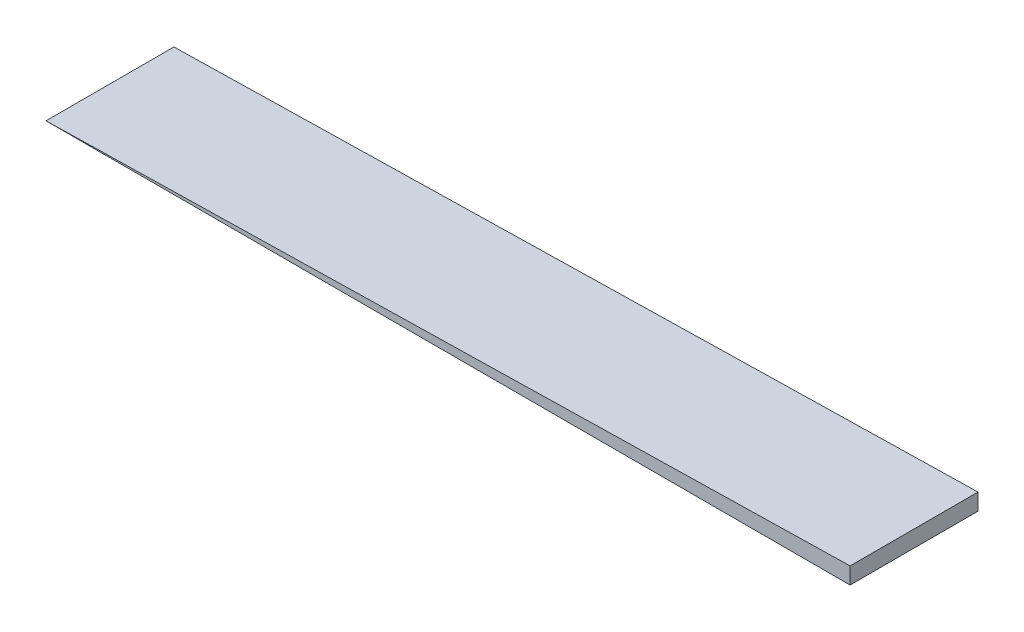
ISO-10303-21;
HEADER;
FILE_DESCRIPTION(('STEP AP214'),'2;1');
FILE_NAME('part.step','',(''),(''),'','','');
FILE_SCHEMA(('AUTOMOTIVE_DESIGN { 1 0 10303 214 1 1 1 1 }'));
ENDSEC;
DATA;
#1=APPLICATION_CONTEXT('core data for automotive mechanical design processes');
#2=APPLICATION_PROTOCOL_DEFINITION('international standard','automotive_design',2000,#1);
#3=PRODUCT_CONTEXT('',#1,'mechanical');
#4=PRODUCT('Part','Part','',(#3));
#5=PRODUCT_RELATED_PRODUCT_CATEGORY('part','',(#4));
#6=PRODUCT_DEFINITION_FORMATION('','',#4);
#7=PRODUCT_DEFINITION_CONTEXT('part definition',#1,'design');
#8=PRODUCT_DEFINITION('design','',#6,#7);
#9=PRODUCT_DEFINITION_SHAPE('','',#8);
#10=(LENGTH_UNIT() NAMED_UNIT(*) SI_UNIT(.MILLI.,.METRE.));
#11=(NAMED_UNIT(*) PLANE_ANGLE_UNIT() SI_UNIT($,.RADIAN.));
#12=(NAMED_UNIT(*) SI_UNIT($,.STERADIAN.) SOLID_ANGLE_UNIT());
#13=UNCERTAINTY_MEASURE_WITH_UNIT(LENGTH_MEASURE(1.E-05),#10,'distance_accuracy_value','');
#14=(GEOMETRIC_REPRESENTATION_CONTEXT(3) GLOBAL_UNCERTAINTY_ASSIGNED_CONTEXT((#13)) GLOBAL_UNIT_ASSIGNED_CONTEXT((#10,
#11,#12)) REPRESENTATION_CONTEXT('',''));
#15=CARTESIAN_POINT('',(0.,0.,0.));
#16=DIRECTION('',(0.,0.,1.));
#17=DIRECTION('',(1.,0.,0.));
#18=AXIS2_PLACEMENT_3D('',#15,#16,#17);
#19=CARTESIAN_POINT('',(558.8,11.5198062486282,44.45));
#20=DIRECTION('',(0.0206108789081752,-0.999787573272759,0.));
#21=DIRECTION('',(0.999787573272759,0.0206108789081752,0.));
#22=AXIS2_PLACEMENT_3D('',#19,#20,#21);
#23=PLANE('',#22);
#24=DIRECTION('',(-0.999787573272759,-0.0206108789081752,0.));
#25=VECTOR('',#24,1.);
#26=CARTESIAN_POINT('',(558.8,11.5198062486282,-44.45));
#27=LINE('',#26,#25);
#28=CARTESIAN_POINT('',(558.8,11.5198062486282,-44.45));
#29=VERTEX_POINT('',#28);
#30=CARTESIAN_POINT('',(0.,0.,-44.45));
#31=VERTEX_POINT('',#30);
#32=EDGE_CURVE('E85',#29,#31,#27,.T.);
#33=ORIENTED_EDGE('',*,*,#32,.T.);
#34=DIRECTION('',(0.,0.,-1.));
#35=VECTOR('',#34,1.);
#36=CARTESIAN_POINT('',(0.,0.,44.45));
#37=LINE('',#36,#35);
#38=CARTESIAN_POINT('',(0.,0.,44.45));
#39=VERTEX_POINT('',#38);
#40=EDGE_CURVE('E11',#39,#31,#37,.T.);
#41=ORIENTED_EDGE('',*,*,#40,.F.);
#42=DIRECTION('',(-0.999787573272759,-0.0206108789081752,0.));
#43=VECTOR('',#42,1.);
#44=CARTESIAN_POINT('',(558.8,11.5198062486282,44.45));
#45=LINE('',#44,#43);
#46=CARTESIAN_POINT('',(558.8,11.5198062486282,44.45));
#47=VERTEX_POINT('',#46);
#48=EDGE_CURVE('E77',#47,#39,#45,.T.);
#49=ORIENTED_EDGE('',*,*,#48,.F.);
#50=DIRECTION('',(0.,0.,-1.));
#51=VECTOR('',#50,1.);
#52=CARTESIAN_POINT('',(558.8,11.5198062486282,44.45));
#53=LINE('',#52,#51);
#54=EDGE_CURVE('E86',#47,#29,#53,.T.);
#55=ORIENTED_EDGE('',*,*,#54,.T.);
#56=EDGE_LOOP('',(#33,#41,#49,#55));
#57=FACE_BOUND('',#56,.T.);
#58=ADVANCED_FACE('F36',(#57),#23,.F.);
#59=CARTESIAN_POINT('',(0.,0.,44.45));
#60=DIRECTION('',(0.,1.,0.));
#61=DIRECTION('',(0.,0.,1.));
#62=AXIS2_PLACEMENT_3D('',#59,#60,#61);
#63=PLANE('',#62);
#64=DIRECTION('',(1.,0.,0.));
#65=VECTOR('',#64,1.);
#66=CARTESIAN_POINT('',(0.,0.,-44.45));
#67=LINE('',#66,#65);
#68=CARTESIAN_POINT('',(558.8,0.,-44.45));
#69=VERTEX_POINT('',#68);
#70=EDGE_CURVE('E64',#31,#69,#67,.T.);
#71=ORIENTED_EDGE('',*,*,#70,.T.);
#72=DIRECTION('',(0.,0.,-1.));
#73=VECTOR('',#72,1.);
#74=CARTESIAN_POINT('',(558.8,0.,44.45));
#75=LINE('',#74,#73);
#76=CARTESIAN_POINT('',(558.8,0.,44.45));
#77=VERTEX_POINT('',#76);
#78=EDGE_CURVE('E44',#77,#69,#75,.T.);
#79=ORIENTED_EDGE('',*,*,#78,.F.);
#80=DIRECTION('',(1.,0.,0.));
#81=VECTOR('',#80,1.);
#82=CARTESIAN_POINT('',(0.,0.,44.45));
#83=LINE('',#82,#81);
#84=EDGE_CURVE('E72',#39,#77,#83,.T.);
#85=ORIENTED_EDGE('',*,*,#84,.F.);
#86=ORIENTED_EDGE('',*,*,#40,.T.);
#87=EDGE_LOOP('',(#71,#79,#85,#86));
#88=FACE_BOUND('',#87,.T.);
#89=ADVANCED_FACE('F73',(#88),#63,.F.);
#90=CARTESIAN_POINT('',(558.8,0.,44.45));
#91=DIRECTION('',(-1.,0.,0.));
#92=DIRECTION('',(0.,0.,1.));
#93=AXIS2_PLACEMENT_3D('',#90,#91,#92);
#94=PLANE('',#93);
#95=DIRECTION('',(0.,1.,0.));
#96=VECTOR('',#95,1.);
#97=CARTESIAN_POINT('',(558.8,0.,-44.45));
#98=LINE('',#97,#96);
#99=EDGE_CURVE('E69',#69,#29,#98,.T.);
#100=ORIENTED_EDGE('',*,*,#99,.T.);
#101=ORIENTED_EDGE('',*,*,#54,.F.);
#102=DIRECTION('',(0.,1.,0.));
#103=VECTOR('',#102,1.);
#104=CARTESIAN_POINT('',(558.8,0.,44.45));
#105=LINE('',#104,#103);
#106=EDGE_CURVE('E52',#77,#47,#105,.T.);
#107=ORIENTED_EDGE('',*,*,#106,.F.);
#108=ORIENTED_EDGE('',*,*,#78,.T.);
#109=EDGE_LOOP('',(#100,#101,#107,#108));
#110=FACE_BOUND('',#109,.T.);
#111=ADVANCED_FACE('F97',(#110),#94,.F.);
#112=CARTESIAN_POINT('',(0.,0.,44.45));
#113=DIRECTION('',(0.,0.,-1.));
#114=DIRECTION('',(-1.,0.,0.));
#115=AXIS2_PLACEMENT_3D('',#112,#113,#114);
#116=PLANE('',#115);
#117=ORIENTED_EDGE('',*,*,#48,.T.);
#118=ORIENTED_EDGE('',*,*,#84,.T.);
#119=ORIENTED_EDGE('',*,*,#106,.T.);
#120=EDGE_LOOP('',(#117,#118,#119));
#121=FACE_BOUND('',#120,.T.);
#122=ADVANCED_FACE('F80',(#121),#116,.F.);
#123=CARTESIAN_POINT('',(0.,0.,-44.45));
#124=DIRECTION('',(0.,0.,-1.));
#125=DIRECTION('',(-1.,0.,0.));
#126=AXIS2_PLACEMENT_3D('',#123,#124,#125);
#127=PLANE('',#126);
#128=ORIENTED_EDGE('',*,*,#32,.F.);
#129=ORIENTED_EDGE('',*,*,#99,.F.);
#130=ORIENTED_EDGE('',*,*,#70,.F.);
#131=EDGE_LOOP('',(#128,#129,#130));
#132=FACE_BOUND('',#131,.T.);
#133=ADVANCED_FACE('F98',(#132),#127,.T.);
#134=CLOSED_SHELL('',(#58,#89,#111,#122,#133));
#135=MANIFOLD_SOLID_BREP('B2',#134);
#136=ADVANCED_BREP_SHAPE_REPRESENTATION('',(#18,#135),#14);
#137=SHAPE_DEFINITION_REPRESENTATION(#9,#136);
ENDSEC;
END-ISO-10303-21;
